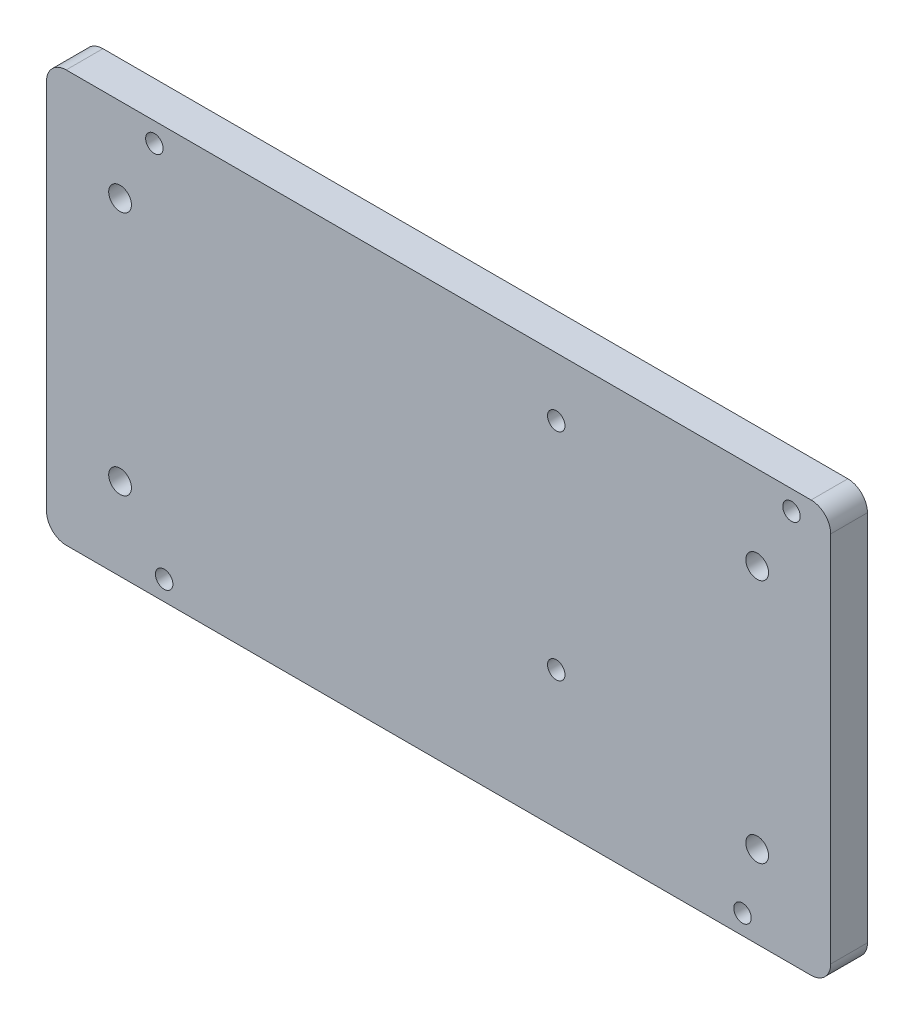
ISO-10303-21;
HEADER;
FILE_DESCRIPTION(('STEP AP214'),'2;1');
FILE_NAME('part.step','',(''),(''),'','','');
FILE_SCHEMA(('AUTOMOTIVE_DESIGN { 1 0 10303 214 1 1 1 1 }'));
ENDSEC;
DATA;
#1=APPLICATION_CONTEXT('core data for automotive mechanical design processes');
#2=APPLICATION_PROTOCOL_DEFINITION('international standard','automotive_design',2000,#1);
#3=PRODUCT_CONTEXT('',#1,'mechanical');
#4=PRODUCT('Part','Part','',(#3));
#5=PRODUCT_RELATED_PRODUCT_CATEGORY('part','',(#4));
#6=PRODUCT_DEFINITION_FORMATION('','',#4);
#7=PRODUCT_DEFINITION_CONTEXT('part definition',#1,'design');
#8=PRODUCT_DEFINITION('design','',#6,#7);
#9=PRODUCT_DEFINITION_SHAPE('','',#8);
#10=(LENGTH_UNIT() NAMED_UNIT(*) SI_UNIT(.MILLI.,.METRE.));
#11=(NAMED_UNIT(*) PLANE_ANGLE_UNIT() SI_UNIT($,.RADIAN.));
#12=(NAMED_UNIT(*) SI_UNIT($,.STERADIAN.) SOLID_ANGLE_UNIT());
#13=UNCERTAINTY_MEASURE_WITH_UNIT(LENGTH_MEASURE(1.E-05),#10,'distance_accuracy_value','');
#14=(GEOMETRIC_REPRESENTATION_CONTEXT(3) GLOBAL_UNCERTAINTY_ASSIGNED_CONTEXT((#13)) GLOBAL_UNIT_ASSIGNED_CONTEXT((#10,
#11,#12)) REPRESENTATION_CONTEXT('',''));
#15=CARTESIAN_POINT('',(0.,0.,0.));
#16=DIRECTION('',(0.,0.,1.));
#17=DIRECTION('',(1.,0.,0.));
#18=AXIS2_PLACEMENT_3D('',#15,#16,#17);
#19=CARTESIAN_POINT('',(0.,0.,4.7625));
#20=DIRECTION('',(0.,0.,-1.));
#21=DIRECTION('',(-1.,0.,0.));
#22=AXIS2_PLACEMENT_3D('',#19,#20,#21);
#23=PLANE('',#22);
#24=CARTESIAN_POINT('',(9.525,10.668,4.7625));
#25=DIRECTION('',(0.,0.,1.));
#26=DIRECTION('',(1.,0.,0.));
#27=AXIS2_PLACEMENT_3D('',#24,#25,#26);
#28=CIRCLE('',#27,1.4732);
#29=CARTESIAN_POINT('',(10.9982,10.668,4.7625));
#30=VERTEX_POINT('',#29);
#31=EDGE_CURVE('E232',#30,#30,#28,.T.);
#32=ORIENTED_EDGE('',*,*,#31,.F.);
#33=EDGE_LOOP('',(#32));
#34=FACE_BOUND('',#33,.T.);
#35=CARTESIAN_POINT('',(92.075,42.418,4.7625));
#36=DIRECTION('',(0.,0.,1.));
#37=DIRECTION('',(1.,0.,0.));
#38=AXIS2_PLACEMENT_3D('',#35,#36,#37);
#39=CIRCLE('',#38,1.47319999999999);
#40=CARTESIAN_POINT('',(93.5482,42.418,4.7625));
#41=VERTEX_POINT('',#40);
#42=EDGE_CURVE('E226',#41,#41,#39,.T.);
#43=ORIENTED_EDGE('',*,*,#42,.F.);
#44=EDGE_LOOP('',(#43));
#45=FACE_BOUND('',#44,.T.);
#46=CARTESIAN_POINT('',(92.075,10.668,4.7625));
#47=DIRECTION('',(0.,0.,1.));
#48=DIRECTION('',(1.,0.,0.));
#49=AXIS2_PLACEMENT_3D('',#46,#47,#48);
#50=CIRCLE('',#49,1.47319999999999);
#51=CARTESIAN_POINT('',(93.5482,10.668,4.7625));
#52=VERTEX_POINT('',#51);
#53=EDGE_CURVE('E220',#52,#52,#50,.T.);
#54=ORIENTED_EDGE('',*,*,#53,.F.);
#55=EDGE_LOOP('',(#54));
#56=FACE_BOUND('',#55,.T.);
#57=CARTESIAN_POINT('',(15.24,2.54000000000001,4.7625));
#58=DIRECTION('',(0.,0.,-1.));
#59=DIRECTION('',(-1.,0.,0.));
#60=AXIS2_PLACEMENT_3D('',#57,#58,#59);
#61=CIRCLE('',#60,1.1303);
#62=CARTESIAN_POINT('',(14.1097,2.54000000000001,4.7625));
#63=VERTEX_POINT('',#62);
#64=EDGE_CURVE('E211',#63,#63,#61,.T.);
#65=ORIENTED_EDGE('',*,*,#64,.T.);
#66=EDGE_LOOP('',(#65));
#67=FACE_BOUND('',#66,.T.);
#68=CARTESIAN_POINT('',(90.17,2.54000000000001,4.7625));
#69=DIRECTION('',(0.,0.,-1.));
#70=DIRECTION('',(-1.,0.,0.));
#71=AXIS2_PLACEMENT_3D('',#68,#69,#70);
#72=CIRCLE('',#71,1.1303);
#73=CARTESIAN_POINT('',(89.0397,2.54000000000001,4.7625));
#74=VERTEX_POINT('',#73);
#75=EDGE_CURVE('E205',#74,#74,#72,.T.);
#76=ORIENTED_EDGE('',*,*,#75,.T.);
#77=EDGE_LOOP('',(#76));
#78=FACE_BOUND('',#77,.T.);
#79=CARTESIAN_POINT('',(96.52,50.8,4.7625));
#80=DIRECTION('',(0.,0.,-1.));
#81=DIRECTION('',(-1.,0.,0.));
#82=AXIS2_PLACEMENT_3D('',#79,#80,#81);
#83=CIRCLE('',#82,1.1303);
#84=CARTESIAN_POINT('',(95.3897,50.8,4.7625));
#85=VERTEX_POINT('',#84);
#86=EDGE_CURVE('E199',#85,#85,#83,.T.);
#87=ORIENTED_EDGE('',*,*,#86,.T.);
#88=EDGE_LOOP('',(#87));
#89=FACE_BOUND('',#88,.T.);
#90=CARTESIAN_POINT('',(66.04,17.78,4.7625));
#91=DIRECTION('',(0.,0.,-1.));
#92=DIRECTION('',(-1.,0.,0.));
#93=AXIS2_PLACEMENT_3D('',#90,#91,#92);
#94=CIRCLE('',#93,1.1303);
#95=CARTESIAN_POINT('',(64.9097,17.78,4.7625));
#96=VERTEX_POINT('',#95);
#97=EDGE_CURVE('E193',#96,#96,#94,.T.);
#98=ORIENTED_EDGE('',*,*,#97,.T.);
#99=EDGE_LOOP('',(#98));
#100=FACE_BOUND('',#99,.T.);
#101=CARTESIAN_POINT('',(66.04,45.72,4.7625));
#102=DIRECTION('',(0.,0.,-1.));
#103=DIRECTION('',(-1.,0.,0.));
#104=AXIS2_PLACEMENT_3D('',#101,#102,#103);
#105=CIRCLE('',#104,1.1303);
#106=CARTESIAN_POINT('',(64.9097,45.72,4.7625));
#107=VERTEX_POINT('',#106);
#108=EDGE_CURVE('E184',#107,#107,#105,.T.);
#109=ORIENTED_EDGE('',*,*,#108,.T.);
#110=EDGE_LOOP('',(#109));
#111=FACE_BOUND('',#110,.T.);
#112=CARTESIAN_POINT('',(13.97,50.8,4.7625));
#113=DIRECTION('',(0.,0.,-1.));
#114=DIRECTION('',(-1.,0.,0.));
#115=AXIS2_PLACEMENT_3D('',#112,#113,#114);
#116=CIRCLE('',#115,1.1303);
#117=CARTESIAN_POINT('',(12.8397,50.8,4.7625));
#118=VERTEX_POINT('',#117);
#119=EDGE_CURVE('E175',#118,#118,#116,.T.);
#120=ORIENTED_EDGE('',*,*,#119,.T.);
#121=EDGE_LOOP('',(#120));
#122=FACE_BOUND('',#121,.T.);
#123=DIRECTION('',(1.,0.,0.));
#124=VECTOR('',#123,1.);
#125=CARTESIAN_POINT('',(0.,0.,4.7625));
#126=LINE('',#125,#124);
#127=CARTESIAN_POINT('',(2.54,0.,4.7625));
#128=VERTEX_POINT('',#127);
#129=CARTESIAN_POINT('',(99.06,0.,4.7625));
#130=VERTEX_POINT('',#129);
#131=EDGE_CURVE('E170',#128,#130,#126,.T.);
#132=ORIENTED_EDGE('',*,*,#131,.T.);
#133=CARTESIAN_POINT('',(99.06,2.54,4.7625));
#134=DIRECTION('',(0.,0.,-1.));
#135=DIRECTION('',(-1.,0.,0.));
#136=AXIS2_PLACEMENT_3D('',#133,#134,#135);
#137=CIRCLE('',#136,2.54);
#138=CARTESIAN_POINT('',(101.6,2.54,4.7625));
#139=VERTEX_POINT('',#138);
#140=EDGE_CURVE('E148',#130,#139,#137,.F.);
#141=ORIENTED_EDGE('',*,*,#140,.T.);
#142=DIRECTION('',(0.,1.,0.));
#143=VECTOR('',#142,1.);
#144=CARTESIAN_POINT('',(101.6,0.,4.7625));
#145=LINE('',#144,#143);
#146=CARTESIAN_POINT('',(101.6,50.8,4.7625));
#147=VERTEX_POINT('',#146);
#148=EDGE_CURVE('E119',#139,#147,#145,.T.);
#149=ORIENTED_EDGE('',*,*,#148,.T.);
#150=CARTESIAN_POINT('',(99.06,50.8,4.7625));
#151=DIRECTION('',(0.,0.,-1.));
#152=DIRECTION('',(-1.,0.,0.));
#153=AXIS2_PLACEMENT_3D('',#150,#151,#152);
#154=CIRCLE('',#153,2.54);
#155=CARTESIAN_POINT('',(99.06,53.34,4.7625));
#156=VERTEX_POINT('',#155);
#157=EDGE_CURVE('E55',#147,#156,#154,.F.);
#158=ORIENTED_EDGE('',*,*,#157,.T.);
#159=DIRECTION('',(-1.,0.,0.));
#160=VECTOR('',#159,1.);
#161=CARTESIAN_POINT('',(0.,53.34,4.7625));
#162=LINE('',#161,#160);
#163=CARTESIAN_POINT('',(2.54,53.34,4.7625));
#164=VERTEX_POINT('',#163);
#165=EDGE_CURVE('E134',#156,#164,#162,.T.);
#166=ORIENTED_EDGE('',*,*,#165,.T.);
#167=CARTESIAN_POINT('',(2.54,50.8,4.7625));
#168=DIRECTION('',(0.,0.,-1.));
#169=DIRECTION('',(-1.,0.,0.));
#170=AXIS2_PLACEMENT_3D('',#167,#168,#169);
#171=CIRCLE('',#170,2.54);
#172=CARTESIAN_POINT('',(0.,50.8,4.7625));
#173=VERTEX_POINT('',#172);
#174=EDGE_CURVE('E144',#164,#173,#171,.F.);
#175=ORIENTED_EDGE('',*,*,#174,.T.);
#176=DIRECTION('',(0.,-1.,0.));
#177=VECTOR('',#176,1.);
#178=CARTESIAN_POINT('',(0.,0.,4.7625));
#179=LINE('',#178,#177);
#180=CARTESIAN_POINT('',(0.,2.54,4.7625));
#181=VERTEX_POINT('',#180);
#182=EDGE_CURVE('E128',#173,#181,#179,.T.);
#183=ORIENTED_EDGE('',*,*,#182,.T.);
#184=CARTESIAN_POINT('',(2.54,2.54,4.7625));
#185=DIRECTION('',(0.,0.,-1.));
#186=DIRECTION('',(-1.,0.,0.));
#187=AXIS2_PLACEMENT_3D('',#184,#185,#186);
#188=CIRCLE('',#187,2.54);
#189=EDGE_CURVE('E146',#181,#128,#188,.F.);
#190=ORIENTED_EDGE('',*,*,#189,.T.);
#191=EDGE_LOOP('',(#132,#141,#149,#158,#166,#175,#183,#190));
#192=FACE_BOUND('',#191,.T.);
#193=CARTESIAN_POINT('',(9.525,42.418,4.7625));
#194=DIRECTION('',(0.,0.,1.));
#195=DIRECTION('',(1.,0.,0.));
#196=AXIS2_PLACEMENT_3D('',#193,#194,#195);
#197=CIRCLE('',#196,1.4732);
#198=CARTESIAN_POINT('',(10.9982,42.418,4.7625));
#199=VERTEX_POINT('',#198);
#200=EDGE_CURVE('E238',#199,#199,#197,.T.);
#201=ORIENTED_EDGE('',*,*,#200,.F.);
#202=EDGE_LOOP('',(#201));
#203=FACE_BOUND('',#202,.T.);
#204=ADVANCED_FACE('F35',(#34,#45,#56,#67,#78,#89,#100,#111,#122,#192,#203),#23,.F.);
#205=CARTESIAN_POINT('',(0.,0.,4.7625));
#206=DIRECTION('',(1.,0.,0.));
#207=DIRECTION('',(0.,0.,-1.));
#208=AXIS2_PLACEMENT_3D('',#205,#206,#207);
#209=PLANE('',#208);
#210=DIRECTION('',(0.,-1.,0.));
#211=VECTOR('',#210,1.);
#212=CARTESIAN_POINT('',(0.,0.,0.));
#213=LINE('',#212,#211);
#214=CARTESIAN_POINT('',(0.,50.8,0.));
#215=VERTEX_POINT('',#214);
#216=CARTESIAN_POINT('',(0.,2.54,0.));
#217=VERTEX_POINT('',#216);
#218=EDGE_CURVE('E130',#215,#217,#213,.T.);
#219=ORIENTED_EDGE('',*,*,#218,.T.);
#220=DIRECTION('',(0.,0.,-1.));
#221=VECTOR('',#220,1.);
#222=CARTESIAN_POINT('',(0.,2.54,4.7625));
#223=LINE('',#222,#221);
#224=EDGE_CURVE('E153',#217,#181,#223,.F.);
#225=ORIENTED_EDGE('',*,*,#224,.T.);
#226=ORIENTED_EDGE('',*,*,#182,.F.);
#227=DIRECTION('',(0.,0.,-1.));
#228=VECTOR('',#227,1.);
#229=CARTESIAN_POINT('',(0.,50.8,4.7625));
#230=LINE('',#229,#228);
#231=EDGE_CURVE('E150',#173,#215,#230,.T.);
#232=ORIENTED_EDGE('',*,*,#231,.T.);
#233=EDGE_LOOP('',(#219,#225,#226,#232));
#234=FACE_BOUND('',#233,.T.);
#235=ADVANCED_FACE('F166',(#234),#209,.F.);
#236=CARTESIAN_POINT('',(0.,0.,4.7625));
#237=DIRECTION('',(0.,1.,0.));
#238=DIRECTION('',(0.,0.,1.));
#239=AXIS2_PLACEMENT_3D('',#236,#237,#238);
#240=PLANE('',#239);
#241=DIRECTION('',(1.,0.,0.));
#242=VECTOR('',#241,1.);
#243=CARTESIAN_POINT('',(0.,0.,0.));
#244=LINE('',#243,#242);
#245=CARTESIAN_POINT('',(2.54,0.,0.));
#246=VERTEX_POINT('',#245);
#247=CARTESIAN_POINT('',(99.06,0.,0.));
#248=VERTEX_POINT('',#247);
#249=EDGE_CURVE('E126',#246,#248,#244,.T.);
#250=ORIENTED_EDGE('',*,*,#249,.T.);
#251=DIRECTION('',(0.,0.,-1.));
#252=VECTOR('',#251,1.);
#253=CARTESIAN_POINT('',(99.06,0.,4.7625));
#254=LINE('',#253,#252);
#255=EDGE_CURVE('E105',#248,#130,#254,.F.);
#256=ORIENTED_EDGE('',*,*,#255,.T.);
#257=ORIENTED_EDGE('',*,*,#131,.F.);
#258=DIRECTION('',(0.,0.,-1.));
#259=VECTOR('',#258,1.);
#260=CARTESIAN_POINT('',(2.54,0.,4.7625));
#261=LINE('',#260,#259);
#262=EDGE_CURVE('E110',#128,#246,#261,.T.);
#263=ORIENTED_EDGE('',*,*,#262,.T.);
#264=EDGE_LOOP('',(#250,#256,#257,#263));
#265=FACE_BOUND('',#264,.T.);
#266=ADVANCED_FACE('F250',(#265),#240,.F.);
#267=CARTESIAN_POINT('',(101.6,0.,4.7625));
#268=DIRECTION('',(-1.,0.,0.));
#269=DIRECTION('',(0.,0.,1.));
#270=AXIS2_PLACEMENT_3D('',#267,#268,#269);
#271=PLANE('',#270);
#272=ORIENTED_EDGE('',*,*,#148,.F.);
#273=DIRECTION('',(0.,0.,-1.));
#274=VECTOR('',#273,1.);
#275=CARTESIAN_POINT('',(101.6,2.54,4.7625));
#276=LINE('',#275,#274);
#277=CARTESIAN_POINT('',(101.6,2.54,0.));
#278=VERTEX_POINT('',#277);
#279=EDGE_CURVE('E104',#139,#278,#276,.T.);
#280=ORIENTED_EDGE('',*,*,#279,.T.);
#281=DIRECTION('',(0.,1.,0.));
#282=VECTOR('',#281,1.);
#283=CARTESIAN_POINT('',(101.6,0.,0.));
#284=LINE('',#283,#282);
#285=CARTESIAN_POINT('',(101.6,50.8,0.));
#286=VERTEX_POINT('',#285);
#287=EDGE_CURVE('E117',#278,#286,#284,.T.);
#288=ORIENTED_EDGE('',*,*,#287,.T.);
#289=DIRECTION('',(0.,0.,-1.));
#290=VECTOR('',#289,1.);
#291=CARTESIAN_POINT('',(101.6,50.8,4.7625));
#292=LINE('',#291,#290);
#293=EDGE_CURVE('E121',#286,#147,#292,.F.);
#294=ORIENTED_EDGE('',*,*,#293,.T.);
#295=EDGE_LOOP('',(#272,#280,#288,#294));
#296=FACE_BOUND('',#295,.T.);
#297=ADVANCED_FACE('F116',(#296),#271,.F.);
#298=CARTESIAN_POINT('',(0.,53.34,4.7625));
#299=DIRECTION('',(0.,-1.,0.));
#300=DIRECTION('',(0.,0.,-1.));
#301=AXIS2_PLACEMENT_3D('',#298,#299,#300);
#302=PLANE('',#301);
#303=DIRECTION('',(-1.,0.,0.));
#304=VECTOR('',#303,1.);
#305=CARTESIAN_POINT('',(0.,53.34,0.));
#306=LINE('',#305,#304);
#307=CARTESIAN_POINT('',(99.06,53.34,0.));
#308=VERTEX_POINT('',#307);
#309=CARTESIAN_POINT('',(2.54,53.34,0.));
#310=VERTEX_POINT('',#309);
#311=EDGE_CURVE('E125',#308,#310,#306,.T.);
#312=ORIENTED_EDGE('',*,*,#311,.T.);
#313=DIRECTION('',(0.,0.,-1.));
#314=VECTOR('',#313,1.);
#315=CARTESIAN_POINT('',(2.54,53.34,4.7625));
#316=LINE('',#315,#314);
#317=EDGE_CURVE('E11',#310,#164,#316,.F.);
#318=ORIENTED_EDGE('',*,*,#317,.T.);
#319=ORIENTED_EDGE('',*,*,#165,.F.);
#320=DIRECTION('',(0.,0.,-1.));
#321=VECTOR('',#320,1.);
#322=CARTESIAN_POINT('',(99.06,53.34,4.7625));
#323=LINE('',#322,#321);
#324=EDGE_CURVE('E43',#156,#308,#323,.T.);
#325=ORIENTED_EDGE('',*,*,#324,.T.);
#326=EDGE_LOOP('',(#312,#318,#319,#325));
#327=FACE_BOUND('',#326,.T.);
#328=ADVANCED_FACE('F156',(#327),#302,.F.);
#329=CARTESIAN_POINT('',(0.,0.,0.));
#330=DIRECTION('',(0.,0.,-1.));
#331=DIRECTION('',(-1.,0.,0.));
#332=AXIS2_PLACEMENT_3D('',#329,#330,#331);
#333=PLANE('',#332);
#334=CARTESIAN_POINT('',(9.525,42.418,0.));
#335=DIRECTION('',(0.,0.,1.));
#336=DIRECTION('',(1.,0.,0.));
#337=AXIS2_PLACEMENT_3D('',#334,#335,#336);
#338=CIRCLE('',#337,1.4732);
#339=CARTESIAN_POINT('',(10.9982,42.418,0.));
#340=VERTEX_POINT('',#339);
#341=EDGE_CURVE('E235',#340,#340,#338,.T.);
#342=ORIENTED_EDGE('',*,*,#341,.T.);
#343=EDGE_LOOP('',(#342));
#344=FACE_BOUND('',#343,.T.);
#345=CARTESIAN_POINT('',(9.525,10.668,0.));
#346=DIRECTION('',(0.,0.,1.));
#347=DIRECTION('',(1.,0.,0.));
#348=AXIS2_PLACEMENT_3D('',#345,#346,#347);
#349=CIRCLE('',#348,1.4732);
#350=CARTESIAN_POINT('',(10.9982,10.668,0.));
#351=VERTEX_POINT('',#350);
#352=EDGE_CURVE('E229',#351,#351,#349,.T.);
#353=ORIENTED_EDGE('',*,*,#352,.T.);
#354=EDGE_LOOP('',(#353));
#355=FACE_BOUND('',#354,.T.);
#356=CARTESIAN_POINT('',(92.075,42.418,0.));
#357=DIRECTION('',(0.,0.,1.));
#358=DIRECTION('',(1.,0.,0.));
#359=AXIS2_PLACEMENT_3D('',#356,#357,#358);
#360=CIRCLE('',#359,1.47319999999999);
#361=CARTESIAN_POINT('',(93.5482,42.418,0.));
#362=VERTEX_POINT('',#361);
#363=EDGE_CURVE('E223',#362,#362,#360,.T.);
#364=ORIENTED_EDGE('',*,*,#363,.T.);
#365=EDGE_LOOP('',(#364));
#366=FACE_BOUND('',#365,.T.);
#367=CARTESIAN_POINT('',(92.075,10.668,0.));
#368=DIRECTION('',(0.,0.,1.));
#369=DIRECTION('',(1.,0.,0.));
#370=AXIS2_PLACEMENT_3D('',#367,#368,#369);
#371=CIRCLE('',#370,1.47319999999999);
#372=CARTESIAN_POINT('',(93.5482,10.668,0.));
#373=VERTEX_POINT('',#372);
#374=EDGE_CURVE('E217',#373,#373,#371,.T.);
#375=ORIENTED_EDGE('',*,*,#374,.T.);
#376=EDGE_LOOP('',(#375));
#377=FACE_BOUND('',#376,.T.);
#378=CARTESIAN_POINT('',(15.24,2.54000000000001,0.));
#379=DIRECTION('',(0.,0.,-1.));
#380=DIRECTION('',(-1.,0.,0.));
#381=AXIS2_PLACEMENT_3D('',#378,#379,#380);
#382=CIRCLE('',#381,1.1303);
#383=CARTESIAN_POINT('',(14.1097,2.54000000000001,0.));
#384=VERTEX_POINT('',#383);
#385=EDGE_CURVE('E214',#384,#384,#382,.T.);
#386=ORIENTED_EDGE('',*,*,#385,.F.);
#387=EDGE_LOOP('',(#386));
#388=FACE_BOUND('',#387,.T.);
#389=CARTESIAN_POINT('',(90.17,2.54000000000001,0.));
#390=DIRECTION('',(0.,0.,-1.));
#391=DIRECTION('',(-1.,0.,0.));
#392=AXIS2_PLACEMENT_3D('',#389,#390,#391);
#393=CIRCLE('',#392,1.1303);
#394=CARTESIAN_POINT('',(89.0397,2.54000000000001,0.));
#395=VERTEX_POINT('',#394);
#396=EDGE_CURVE('E208',#395,#395,#393,.T.);
#397=ORIENTED_EDGE('',*,*,#396,.F.);
#398=EDGE_LOOP('',(#397));
#399=FACE_BOUND('',#398,.T.);
#400=CARTESIAN_POINT('',(96.52,50.8,0.));
#401=DIRECTION('',(0.,0.,-1.));
#402=DIRECTION('',(-1.,0.,0.));
#403=AXIS2_PLACEMENT_3D('',#400,#401,#402);
#404=CIRCLE('',#403,1.1303);
#405=CARTESIAN_POINT('',(95.3897,50.8,0.));
#406=VERTEX_POINT('',#405);
#407=EDGE_CURVE('E202',#406,#406,#404,.T.);
#408=ORIENTED_EDGE('',*,*,#407,.F.);
#409=EDGE_LOOP('',(#408));
#410=FACE_BOUND('',#409,.T.);
#411=CARTESIAN_POINT('',(66.04,17.78,0.));
#412=DIRECTION('',(0.,0.,-1.));
#413=DIRECTION('',(-1.,0.,0.));
#414=AXIS2_PLACEMENT_3D('',#411,#412,#413);
#415=CIRCLE('',#414,1.1303);
#416=CARTESIAN_POINT('',(64.9097,17.78,0.));
#417=VERTEX_POINT('',#416);
#418=EDGE_CURVE('E196',#417,#417,#415,.T.);
#419=ORIENTED_EDGE('',*,*,#418,.F.);
#420=EDGE_LOOP('',(#419));
#421=FACE_BOUND('',#420,.T.);
#422=CARTESIAN_POINT('',(66.04,45.72,0.));
#423=DIRECTION('',(0.,0.,-1.));
#424=DIRECTION('',(-1.,0.,0.));
#425=AXIS2_PLACEMENT_3D('',#422,#423,#424);
#426=CIRCLE('',#425,1.1303);
#427=CARTESIAN_POINT('',(64.9097,45.72,0.));
#428=VERTEX_POINT('',#427);
#429=EDGE_CURVE('E188',#428,#428,#426,.T.);
#430=ORIENTED_EDGE('',*,*,#429,.F.);
#431=EDGE_LOOP('',(#430));
#432=FACE_BOUND('',#431,.T.);
#433=CARTESIAN_POINT('',(13.97,50.8,0.));
#434=DIRECTION('',(0.,0.,-1.));
#435=DIRECTION('',(-1.,0.,0.));
#436=AXIS2_PLACEMENT_3D('',#433,#434,#435);
#437=CIRCLE('',#436,1.1303);
#438=CARTESIAN_POINT('',(12.8397,50.8,0.));
#439=VERTEX_POINT('',#438);
#440=EDGE_CURVE('E180',#439,#439,#437,.T.);
#441=ORIENTED_EDGE('',*,*,#440,.F.);
#442=EDGE_LOOP('',(#441));
#443=FACE_BOUND('',#442,.T.);
#444=ORIENTED_EDGE('',*,*,#287,.F.);
#445=CARTESIAN_POINT('',(99.06,2.54,0.));
#446=DIRECTION('',(0.,0.,-1.));
#447=DIRECTION('',(-1.,0.,0.));
#448=AXIS2_PLACEMENT_3D('',#445,#446,#447);
#449=CIRCLE('',#448,2.54);
#450=EDGE_CURVE('E100',#278,#248,#449,.T.);
#451=ORIENTED_EDGE('',*,*,#450,.T.);
#452=ORIENTED_EDGE('',*,*,#249,.F.);
#453=CARTESIAN_POINT('',(2.54,2.54,0.));
#454=DIRECTION('',(0.,0.,-1.));
#455=DIRECTION('',(-1.,0.,0.));
#456=AXIS2_PLACEMENT_3D('',#453,#454,#455);
#457=CIRCLE('',#456,2.54);
#458=EDGE_CURVE('E111',#246,#217,#457,.T.);
#459=ORIENTED_EDGE('',*,*,#458,.T.);
#460=ORIENTED_EDGE('',*,*,#218,.F.);
#461=CARTESIAN_POINT('',(2.54,50.8,0.));
#462=DIRECTION('',(0.,0.,-1.));
#463=DIRECTION('',(-1.,0.,0.));
#464=AXIS2_PLACEMENT_3D('',#461,#462,#463);
#465=CIRCLE('',#464,2.54);
#466=EDGE_CURVE('E137',#215,#310,#465,.T.);
#467=ORIENTED_EDGE('',*,*,#466,.T.);
#468=ORIENTED_EDGE('',*,*,#311,.F.);
#469=CARTESIAN_POINT('',(99.06,50.8,0.));
#470=DIRECTION('',(0.,0.,-1.));
#471=DIRECTION('',(-1.,0.,0.));
#472=AXIS2_PLACEMENT_3D('',#469,#470,#471);
#473=CIRCLE('',#472,2.54);
#474=EDGE_CURVE('E120',#308,#286,#473,.T.);
#475=ORIENTED_EDGE('',*,*,#474,.T.);
#476=EDGE_LOOP('',(#444,#451,#452,#459,#460,#467,#468,#475));
#477=FACE_BOUND('',#476,.T.);
#478=ADVANCED_FACE('F123',(#344,#355,#366,#377,#388,#399,#410,#421,#432,#443,#477),#333,.T.);
#479=CARTESIAN_POINT('',(99.06,2.54,4.7625));
#480=DIRECTION('',(0.,0.,-1.));
#481=DIRECTION('',(-1.,0.,0.));
#482=AXIS2_PLACEMENT_3D('',#479,#480,#481);
#483=CYLINDRICAL_SURFACE('',#482,2.54);
#484=ORIENTED_EDGE('',*,*,#140,.F.);
#485=ORIENTED_EDGE('',*,*,#255,.F.);
#486=ORIENTED_EDGE('',*,*,#450,.F.);
#487=ORIENTED_EDGE('',*,*,#279,.F.);
#488=EDGE_LOOP('',(#484,#485,#486,#487));
#489=FACE_BOUND('',#488,.T.);
#490=ADVANCED_FACE('F103',(#489),#483,.T.);
#491=CARTESIAN_POINT('',(2.54,2.54,4.7625));
#492=DIRECTION('',(0.,0.,-1.));
#493=DIRECTION('',(-1.,0.,0.));
#494=AXIS2_PLACEMENT_3D('',#491,#492,#493);
#495=CYLINDRICAL_SURFACE('',#494,2.54);
#496=ORIENTED_EDGE('',*,*,#189,.F.);
#497=ORIENTED_EDGE('',*,*,#224,.F.);
#498=ORIENTED_EDGE('',*,*,#458,.F.);
#499=ORIENTED_EDGE('',*,*,#262,.F.);
#500=EDGE_LOOP('',(#496,#497,#498,#499));
#501=FACE_BOUND('',#500,.T.);
#502=ADVANCED_FACE('F270',(#501),#495,.T.);
#503=CARTESIAN_POINT('',(2.54,50.8,4.7625));
#504=DIRECTION('',(0.,0.,-1.));
#505=DIRECTION('',(-1.,0.,0.));
#506=AXIS2_PLACEMENT_3D('',#503,#504,#505);
#507=CYLINDRICAL_SURFACE('',#506,2.54);
#508=ORIENTED_EDGE('',*,*,#174,.F.);
#509=ORIENTED_EDGE('',*,*,#317,.F.);
#510=ORIENTED_EDGE('',*,*,#466,.F.);
#511=ORIENTED_EDGE('',*,*,#231,.F.);
#512=EDGE_LOOP('',(#508,#509,#510,#511));
#513=FACE_BOUND('',#512,.T.);
#514=ADVANCED_FACE('F163',(#513),#507,.T.);
#515=CARTESIAN_POINT('',(99.06,50.8,4.7625));
#516=DIRECTION('',(0.,0.,-1.));
#517=DIRECTION('',(-1.,0.,0.));
#518=AXIS2_PLACEMENT_3D('',#515,#516,#517);
#519=CYLINDRICAL_SURFACE('',#518,2.54);
#520=ORIENTED_EDGE('',*,*,#157,.F.);
#521=ORIENTED_EDGE('',*,*,#293,.F.);
#522=ORIENTED_EDGE('',*,*,#474,.F.);
#523=ORIENTED_EDGE('',*,*,#324,.F.);
#524=EDGE_LOOP('',(#520,#521,#522,#523));
#525=FACE_BOUND('',#524,.T.);
#526=ADVANCED_FACE('F37',(#525),#519,.T.);
#527=CARTESIAN_POINT('',(13.97,50.8,0.));
#528=DIRECTION('',(0.,0.,-1.));
#529=DIRECTION('',(-1.,0.,0.));
#530=AXIS2_PLACEMENT_3D('',#527,#528,#529);
#531=CYLINDRICAL_SURFACE('',#530,1.1303);
#532=ORIENTED_EDGE('',*,*,#119,.F.);
#533=EDGE_LOOP('',(#532));
#534=FACE_BOUND('',#533,.T.);
#535=ORIENTED_EDGE('',*,*,#440,.T.);
#536=EDGE_LOOP('',(#535));
#537=FACE_BOUND('',#536,.T.);
#538=ADVANCED_FACE('F256',(#534,#537),#531,.F.);
#539=CARTESIAN_POINT('',(66.04,45.72,0.));
#540=DIRECTION('',(0.,0.,-1.));
#541=DIRECTION('',(-1.,0.,0.));
#542=AXIS2_PLACEMENT_3D('',#539,#540,#541);
#543=CYLINDRICAL_SURFACE('',#542,1.1303);
#544=ORIENTED_EDGE('',*,*,#108,.F.);
#545=EDGE_LOOP('',(#544));
#546=FACE_BOUND('',#545,.T.);
#547=ORIENTED_EDGE('',*,*,#429,.T.);
#548=EDGE_LOOP('',(#547));
#549=FACE_BOUND('',#548,.T.);
#550=ADVANCED_FACE('F280',(#546,#549),#543,.F.);
#551=CARTESIAN_POINT('',(66.04,17.78,0.));
#552=DIRECTION('',(0.,0.,-1.));
#553=DIRECTION('',(-1.,0.,0.));
#554=AXIS2_PLACEMENT_3D('',#551,#552,#553);
#555=CYLINDRICAL_SURFACE('',#554,1.1303);
#556=ORIENTED_EDGE('',*,*,#97,.F.);
#557=EDGE_LOOP('',(#556));
#558=FACE_BOUND('',#557,.T.);
#559=ORIENTED_EDGE('',*,*,#418,.T.);
#560=EDGE_LOOP('',(#559));
#561=FACE_BOUND('',#560,.T.);
#562=ADVANCED_FACE('F287',(#558,#561),#555,.F.);
#563=CARTESIAN_POINT('',(96.52,50.8,0.));
#564=DIRECTION('',(0.,0.,-1.));
#565=DIRECTION('',(-1.,0.,0.));
#566=AXIS2_PLACEMENT_3D('',#563,#564,#565);
#567=CYLINDRICAL_SURFACE('',#566,1.1303);
#568=ORIENTED_EDGE('',*,*,#86,.F.);
#569=EDGE_LOOP('',(#568));
#570=FACE_BOUND('',#569,.T.);
#571=ORIENTED_EDGE('',*,*,#407,.T.);
#572=EDGE_LOOP('',(#571));
#573=FACE_BOUND('',#572,.T.);
#574=ADVANCED_FACE('F292',(#570,#573),#567,.F.);
#575=CARTESIAN_POINT('',(90.17,2.54000000000001,0.));
#576=DIRECTION('',(0.,0.,-1.));
#577=DIRECTION('',(-1.,0.,0.));
#578=AXIS2_PLACEMENT_3D('',#575,#576,#577);
#579=CYLINDRICAL_SURFACE('',#578,1.1303);
#580=ORIENTED_EDGE('',*,*,#75,.F.);
#581=EDGE_LOOP('',(#580));
#582=FACE_BOUND('',#581,.T.);
#583=ORIENTED_EDGE('',*,*,#396,.T.);
#584=EDGE_LOOP('',(#583));
#585=FACE_BOUND('',#584,.T.);
#586=ADVANCED_FACE('F300',(#582,#585),#579,.F.);
#587=CARTESIAN_POINT('',(15.24,2.54000000000001,0.));
#588=DIRECTION('',(0.,0.,-1.));
#589=DIRECTION('',(-1.,0.,0.));
#590=AXIS2_PLACEMENT_3D('',#587,#588,#589);
#591=CYLINDRICAL_SURFACE('',#590,1.1303);
#592=ORIENTED_EDGE('',*,*,#64,.F.);
#593=EDGE_LOOP('',(#592));
#594=FACE_BOUND('',#593,.T.);
#595=ORIENTED_EDGE('',*,*,#385,.T.);
#596=EDGE_LOOP('',(#595));
#597=FACE_BOUND('',#596,.T.);
#598=ADVANCED_FACE('F304',(#594,#597),#591,.F.);
#599=CARTESIAN_POINT('',(92.075,10.668,4.7625));
#600=DIRECTION('',(0.,0.,1.));
#601=DIRECTION('',(1.,0.,0.));
#602=AXIS2_PLACEMENT_3D('',#599,#600,#601);
#603=CYLINDRICAL_SURFACE('',#602,1.47319999999999);
#604=ORIENTED_EDGE('',*,*,#374,.F.);
#605=EDGE_LOOP('',(#604));
#606=FACE_BOUND('',#605,.T.);
#607=ORIENTED_EDGE('',*,*,#53,.T.);
#608=EDGE_LOOP('',(#607));
#609=FACE_BOUND('',#608,.T.);
#610=ADVANCED_FACE('F308',(#606,#609),#603,.F.);
#611=CARTESIAN_POINT('',(92.075,42.418,4.7625));
#612=DIRECTION('',(0.,0.,1.));
#613=DIRECTION('',(1.,0.,0.));
#614=AXIS2_PLACEMENT_3D('',#611,#612,#613);
#615=CYLINDRICAL_SURFACE('',#614,1.47319999999999);
#616=ORIENTED_EDGE('',*,*,#363,.F.);
#617=EDGE_LOOP('',(#616));
#618=FACE_BOUND('',#617,.T.);
#619=ORIENTED_EDGE('',*,*,#42,.T.);
#620=EDGE_LOOP('',(#619));
#621=FACE_BOUND('',#620,.T.);
#622=ADVANCED_FACE('F312',(#618,#621),#615,.F.);
#623=CARTESIAN_POINT('',(9.525,10.668,4.7625));
#624=DIRECTION('',(0.,0.,1.));
#625=DIRECTION('',(1.,0.,0.));
#626=AXIS2_PLACEMENT_3D('',#623,#624,#625);
#627=CYLINDRICAL_SURFACE('',#626,1.4732);
#628=ORIENTED_EDGE('',*,*,#352,.F.);
#629=EDGE_LOOP('',(#628));
#630=FACE_BOUND('',#629,.T.);
#631=ORIENTED_EDGE('',*,*,#31,.T.);
#632=EDGE_LOOP('',(#631));
#633=FACE_BOUND('',#632,.T.);
#634=ADVANCED_FACE('F316',(#630,#633),#627,.F.);
#635=CARTESIAN_POINT('',(9.525,42.418,4.7625));
#636=DIRECTION('',(0.,0.,1.));
#637=DIRECTION('',(1.,0.,0.));
#638=AXIS2_PLACEMENT_3D('',#635,#636,#637);
#639=CYLINDRICAL_SURFACE('',#638,1.4732);
#640=ORIENTED_EDGE('',*,*,#341,.F.);
#641=EDGE_LOOP('',(#640));
#642=FACE_BOUND('',#641,.T.);
#643=ORIENTED_EDGE('',*,*,#200,.T.);
#644=EDGE_LOOP('',(#643));
#645=FACE_BOUND('',#644,.T.);
#646=ADVANCED_FACE('F242',(#642,#645),#639,.F.);
#647=CLOSED_SHELL('',(#204,#235,#266,#297,#328,#478,#490,#502,#514,#526,#538,#550,#562,#574,
#586,#598,#610,#622,#634,#646));
#648=MANIFOLD_SOLID_BREP('B2',#647);
#649=ADVANCED_BREP_SHAPE_REPRESENTATION('',(#18,#648),#14);
#650=SHAPE_DEFINITION_REPRESENTATION(#9,#649);
ENDSEC;
END-ISO-10303-21;
